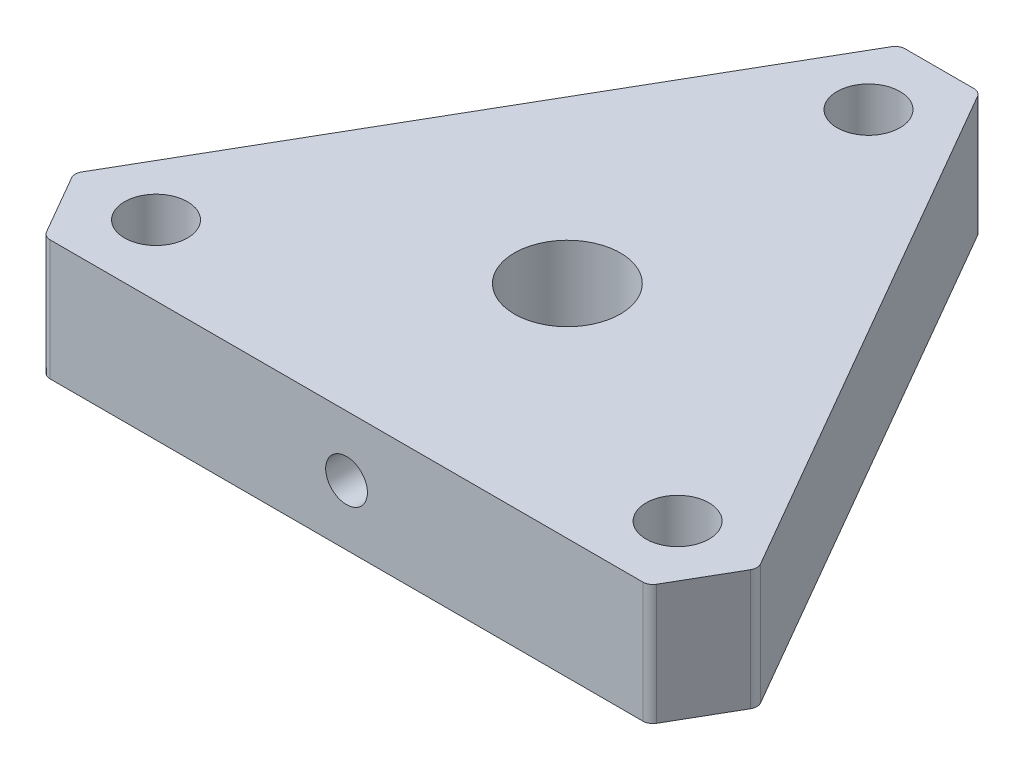
ISO-10303-21;
HEADER;
FILE_DESCRIPTION(('STEP AP214'),'2;1');
FILE_NAME('part.step','',(''),(''),'','','');
FILE_SCHEMA(('AUTOMOTIVE_DESIGN { 1 0 10303 214 1 1 1 1 }'));
ENDSEC;
DATA;
#1=APPLICATION_CONTEXT('core data for automotive mechanical design processes');
#2=APPLICATION_PROTOCOL_DEFINITION('international standard','automotive_design',2000,#1);
#3=PRODUCT_CONTEXT('',#1,'mechanical');
#4=PRODUCT('Part','Part','',(#3));
#5=PRODUCT_RELATED_PRODUCT_CATEGORY('part','',(#4));
#6=PRODUCT_DEFINITION_FORMATION('','',#4);
#7=PRODUCT_DEFINITION_CONTEXT('part definition',#1,'design');
#8=PRODUCT_DEFINITION('design','',#6,#7);
#9=PRODUCT_DEFINITION_SHAPE('','',#8);
#10=(LENGTH_UNIT() NAMED_UNIT(*) SI_UNIT(.MILLI.,.METRE.));
#11=(NAMED_UNIT(*) PLANE_ANGLE_UNIT() SI_UNIT($,.RADIAN.));
#12=(NAMED_UNIT(*) SI_UNIT($,.STERADIAN.) SOLID_ANGLE_UNIT());
#13=UNCERTAINTY_MEASURE_WITH_UNIT(LENGTH_MEASURE(1.E-05),#10,'distance_accuracy_value','');
#14=(GEOMETRIC_REPRESENTATION_CONTEXT(3) GLOBAL_UNCERTAINTY_ASSIGNED_CONTEXT((#13)) GLOBAL_UNIT_ASSIGNED_CONTEXT((#10,
#11,#12)) REPRESENTATION_CONTEXT('',''));
#15=CARTESIAN_POINT('',(0.,0.,0.));
#16=DIRECTION('',(0.,0.,1.));
#17=DIRECTION('',(1.,0.,0.));
#18=AXIS2_PLACEMENT_3D('',#15,#16,#17);
#19=CARTESIAN_POINT('',(-15.1229686135858,-9.525,-8.73125));
#20=DIRECTION('',(0.866025403784439,0.,0.5));
#21=DIRECTION('',(0.5,0.,-0.866025403784439));
#22=AXIS2_PLACEMENT_3D('',#19,#20,#21);
#23=PLANE('',#22);
#24=DIRECTION('',(0.5,0.,-0.866025403784439));
#25=VECTOR('',#24,1.);
#26=CARTESIAN_POINT('',(-15.1229686135858,0.,-8.73125));
#27=LINE('',#26,#25);
#28=CARTESIAN_POINT('',(-26.8418013390869,0.,11.5663636859688));
#29=VERTEX_POINT('',#28);
#30=CARTESIAN_POINT('',(-3.40413588808464,0.,-29.0288636859688));
#31=VERTEX_POINT('',#30);
#32=EDGE_CURVE('E266',#29,#31,#27,.T.);
#33=ORIENTED_EDGE('',*,*,#32,.T.);
#34=DIRECTION('',(0.,1.,0.));
#35=VECTOR('',#34,1.);
#36=CARTESIAN_POINT('',(-3.40413588808464,-9.525,-29.0288636859688));
#37=LINE('',#36,#35);
#38=CARTESIAN_POINT('',(-3.40413588808464,-9.525,-29.0288636859688));
#39=VERTEX_POINT('',#38);
#40=EDGE_CURVE('E156',#31,#39,#37,.F.);
#41=ORIENTED_EDGE('',*,*,#40,.T.);
#42=DIRECTION('',(0.5,0.,-0.866025403784439));
#43=VECTOR('',#42,1.);
#44=CARTESIAN_POINT('',(-15.1229686135858,-9.525,-8.73125));
#45=LINE('',#44,#43);
#46=CARTESIAN_POINT('',(-26.8418013390869,-9.525,11.5663636859688));
#47=VERTEX_POINT('',#46);
#48=EDGE_CURVE('E139',#47,#39,#45,.T.);
#49=ORIENTED_EDGE('',*,*,#48,.F.);
#50=DIRECTION('',(0.,-1.,0.));
#51=VECTOR('',#50,1.);
#52=CARTESIAN_POINT('',(-26.8418013390869,0.,11.5663636859688));
#53=LINE('',#52,#51);
#54=EDGE_CURVE('E153',#47,#29,#53,.F.);
#55=ORIENTED_EDGE('',*,*,#54,.T.);
#56=EDGE_LOOP('',(#33,#41,#49,#55));
#57=FACE_BOUND('',#56,.T.);
#58=ADVANCED_FACE('F42',(#57),#23,.F.);
#59=CARTESIAN_POINT('',(15.1229686135858,-9.525,-8.73124999999999));
#60=DIRECTION('',(-0.866025403784439,0.,0.5));
#61=DIRECTION('',(0.5,0.,0.866025403784439));
#62=AXIS2_PLACEMENT_3D('',#59,#60,#61);
#63=PLANE('',#62);
#64=DIRECTION('',(0.5,0.,0.866025403784439));
#65=VECTOR('',#64,1.);
#66=CARTESIAN_POINT('',(15.1229686135858,-9.525,-8.73124999999999));
#67=LINE('',#66,#65);
#68=CARTESIAN_POINT('',(3.40413588808463,-9.525,-29.0288636859688));
#69=VERTEX_POINT('',#68);
#70=CARTESIAN_POINT('',(26.8418013390869,-9.525,11.5663636859688));
#71=VERTEX_POINT('',#70);
#72=EDGE_CURVE('E254',#69,#71,#67,.T.);
#73=ORIENTED_EDGE('',*,*,#72,.F.);
#74=DIRECTION('',(0.,-1.,0.));
#75=VECTOR('',#74,1.);
#76=CARTESIAN_POINT('',(3.40413588808464,0.,-29.0288636859688));
#77=LINE('',#76,#75);
#78=CARTESIAN_POINT('',(3.40413588808463,0.,-29.0288636859688));
#79=VERTEX_POINT('',#78);
#80=EDGE_CURVE('E210',#69,#79,#77,.F.);
#81=ORIENTED_EDGE('',*,*,#80,.T.);
#82=DIRECTION('',(0.5,0.,0.866025403784439));
#83=VECTOR('',#82,1.);
#84=CARTESIAN_POINT('',(15.1229686135858,0.,-8.73124999999999));
#85=LINE('',#84,#83);
#86=CARTESIAN_POINT('',(26.8418013390869,0.,11.5663636859688));
#87=VERTEX_POINT('',#86);
#88=EDGE_CURVE('E272',#79,#87,#85,.T.);
#89=ORIENTED_EDGE('',*,*,#88,.T.);
#90=DIRECTION('',(0.,1.,0.));
#91=VECTOR('',#90,1.);
#92=CARTESIAN_POINT('',(26.8418013390869,-9.525,11.5663636859688));
#93=LINE('',#92,#91);
#94=EDGE_CURVE('E206',#87,#71,#93,.F.);
#95=ORIENTED_EDGE('',*,*,#94,.T.);
#96=EDGE_LOOP('',(#73,#81,#89,#95));
#97=FACE_BOUND('',#96,.T.);
#98=ADVANCED_FACE('F298',(#97),#63,.F.);
#99=CARTESIAN_POINT('',(0.,-9.525,17.4625));
#100=DIRECTION('',(0.,0.,-1.));
#101=DIRECTION('',(-1.,0.,0.));
#102=AXIS2_PLACEMENT_3D('',#99,#100,#101);
#103=PLANE('',#102);
#104=CARTESIAN_POINT('',(0.,-4.7625,17.4625));
#105=DIRECTION('',(0.,0.,1.));
#106=DIRECTION('',(1.,0.,0.));
#107=AXIS2_PLACEMENT_3D('',#104,#105,#106);
#108=CIRCLE('',#107,1.65);
#109=CARTESIAN_POINT('',(1.65,-4.7625,17.4625));
#110=VERTEX_POINT('',#109);
#111=EDGE_CURVE('E497',#110,#110,#108,.T.);
#112=ORIENTED_EDGE('',*,*,#111,.F.);
#113=EDGE_LOOP('',(#112));
#114=FACE_BOUND('',#113,.T.);
#115=DIRECTION('',(-1.,0.,0.));
#116=VECTOR('',#115,1.);
#117=CARTESIAN_POINT('',(0.,-9.525,17.4625));
#118=LINE('',#117,#116);
#119=CARTESIAN_POINT('',(23.4376654510023,-9.525,17.4625));
#120=VERTEX_POINT('',#119);
#121=CARTESIAN_POINT('',(-23.4376654510022,-9.525,17.4625));
#122=VERTEX_POINT('',#121);
#123=EDGE_CURVE('E158',#120,#122,#118,.T.);
#124=ORIENTED_EDGE('',*,*,#123,.F.);
#125=DIRECTION('',(0.,-1.,0.));
#126=VECTOR('',#125,1.);
#127=CARTESIAN_POINT('',(23.4376654510023,0.,17.4625));
#128=LINE('',#127,#126);
#129=CARTESIAN_POINT('',(23.4376654510023,0.,17.4625));
#130=VERTEX_POINT('',#129);
#131=EDGE_CURVE('E223',#120,#130,#128,.F.);
#132=ORIENTED_EDGE('',*,*,#131,.T.);
#133=DIRECTION('',(-1.,0.,0.));
#134=VECTOR('',#133,1.);
#135=CARTESIAN_POINT('',(0.,0.,17.4625));
#136=LINE('',#135,#134);
#137=CARTESIAN_POINT('',(-23.4376654510022,0.,17.4625));
#138=VERTEX_POINT('',#137);
#139=EDGE_CURVE('E250',#130,#138,#136,.T.);
#140=ORIENTED_EDGE('',*,*,#139,.T.);
#141=DIRECTION('',(0.,1.,0.));
#142=VECTOR('',#141,1.);
#143=CARTESIAN_POINT('',(-23.4376654510022,-9.525,17.4625));
#144=LINE('',#143,#142);
#145=EDGE_CURVE('E219',#138,#122,#144,.F.);
#146=ORIENTED_EDGE('',*,*,#145,.T.);
#147=EDGE_LOOP('',(#124,#132,#140,#146));
#148=FACE_BOUND('',#147,.T.);
#149=ADVANCED_FACE('F248',(#114,#148),#103,.F.);
#150=CARTESIAN_POINT('',(0.,-9.525,0.));
#151=DIRECTION('',(0.,1.,0.));
#152=DIRECTION('',(0.,0.,1.));
#153=AXIS2_PLACEMENT_3D('',#150,#151,#152);
#154=CYLINDRICAL_SURFACE('',#153,4.191);
#155=CARTESIAN_POINT('',(0.,-6.4125,4.191));
#156=CARTESIAN_POINT('',(0.0888158457556823,-6.41249094113766,4.19099341766536));
#157=CARTESIAN_POINT('',(0.177764880560256,-6.40528805716734,4.18814418876151));
#158=CARTESIAN_POINT('',(0.353155927121723,-6.37672334243657,4.17702450689011));
#159=CARTESIAN_POINT('',(0.439590946926124,-6.3553253547076,4.16874021062102));
#160=CARTESIAN_POINT('',(0.607144510389277,-6.29926646932103,4.14764536034035));
#161=CARTESIAN_POINT('',(0.688278901192032,-6.26464744395929,4.13484910585151));
#162=CARTESIAN_POINT('',(0.84352177325669,-6.18329400089782,4.10599494607128));
#163=CARTESIAN_POINT('',(0.917632390428181,-6.13656328257819,4.0899380370337));
#164=CARTESIAN_POINT('',(1.06022307876038,-6.03004625960187,4.05536864600279));
#165=CARTESIAN_POINT('',(1.12833822400152,-5.96979581928466,4.03678156879842));
#166=CARTESIAN_POINT('',(1.25380335570613,-5.83892953605274,3.99959357812475));
#167=CARTESIAN_POINT('',(1.31114838088202,-5.76830894265662,3.98099266222228));
#168=CARTESIAN_POINT('',(1.41586162961505,-5.61503202877802,3.94499915765003));
#169=CARTESIAN_POINT('',(1.46269756189567,-5.53198984934529,3.92769240392701));
#170=CARTESIAN_POINT('',(1.5415745312681,-5.35842188320632,3.89741291058879));
#171=CARTESIAN_POINT('',(1.57362232595398,-5.26789953698217,3.88443819215555));
#172=CARTESIAN_POINT('',(1.62054825265614,-5.08613156046246,3.8650907605999));
#173=CARTESIAN_POINT('',(1.6361237024715,-4.99509537396215,3.85845119541121));
#174=CARTESIAN_POINT('',(1.65184168556898,-4.81147808951401,3.85175033242646));
#175=CARTESIAN_POINT('',(1.65199149406593,-4.71889774044798,3.85168593357646));
#176=CARTESIAN_POINT('',(1.63738364189338,-4.54143610711338,3.85791438799053));
#177=CARTESIAN_POINT('',(1.62362476834576,-4.4564547872734,3.86378131334764));
#178=CARTESIAN_POINT('',(1.58325181281516,-4.29012206675582,3.88049829235843));
#179=CARTESIAN_POINT('',(1.55663556379601,-4.20877128050942,3.89134918601595));
#180=CARTESIAN_POINT('',(1.49080257849365,-4.05008346160615,3.91704661250588));
#181=CARTESIAN_POINT('',(1.45134387869914,-3.97285962277947,3.93196890308473));
#182=CARTESIAN_POINT('',(1.36111561085157,-3.82585198188336,3.96410579365323));
#183=CARTESIAN_POINT('',(1.31034187970958,-3.75607093221447,3.98132123641186));
#184=CARTESIAN_POINT('',(1.19446598451548,-3.62044624594262,4.01767117536539));
#185=CARTESIAN_POINT('',(1.12857695098702,-3.55528581523616,4.03685297491826));
#186=CARTESIAN_POINT('',(0.986597832915397,-3.43672471895447,4.07387816547818));
#187=CARTESIAN_POINT('',(0.910505845613687,-3.38332625179967,4.0917213058671));
#188=CARTESIAN_POINT('',(0.748393400916165,-3.28894591786138,4.12448093323899));
#189=CARTESIAN_POINT('',(0.662214603429931,-3.24821346410338,4.13933681381772));
#190=CARTESIAN_POINT('',(0.483495379818833,-3.18205736439811,4.16399219657345));
#191=CARTESIAN_POINT('',(0.390958105690556,-3.15662619350062,4.17379418384242));
#192=CARTESIAN_POINT('',(0.207881495993995,-3.12315864989849,4.18678859386898));
#193=CARTESIAN_POINT('',(0.117534725496213,-3.11420366048819,4.19032960503432));
#194=CARTESIAN_POINT('',(-0.0634307943026632,-3.11123988946153,4.19149577898519));
#195=CARTESIAN_POINT('',(-0.154049470178872,-3.11722738205413,4.18912241647376));
#196=CARTESIAN_POINT('',(-0.328872867897259,-3.14329705366543,4.1789552553235));
#197=CARTESIAN_POINT('',(-0.41318551210061,-3.16275871219459,4.17140022432156));
#198=CARTESIAN_POINT('',(-0.577275663347891,-3.21438699308657,4.15187501214887));
#199=CARTESIAN_POINT('',(-0.657052583728261,-3.24655525470079,4.13990426132884));
#200=CARTESIAN_POINT('',(-0.812526850993748,-3.32372933839651,4.11226309894459));
#201=CARTESIAN_POINT('',(-0.888027021033902,-3.36909500002039,4.09649147004093));
#202=CARTESIAN_POINT('',(-1.03060573078238,-3.47097513711603,4.06296760337092));
#203=CARTESIAN_POINT('',(-1.09768093922277,-3.52749400004559,4.04521458736227));
#204=CARTESIAN_POINT('',(-1.22600457951162,-3.65432085216207,4.00825839478138));
#205=CARTESIAN_POINT('',(-1.28660562031798,-3.72527972465676,3.98903510930352));
#206=CARTESIAN_POINT('',(-1.39519096125041,-3.87671037023537,3.95236848825752));
#207=CARTESIAN_POINT('',(-1.4431734493971,-3.95718350713151,3.93492540854043));
#208=CARTESIAN_POINT('',(-1.52539196258602,-4.12642137481455,3.90379538539524));
#209=CARTESIAN_POINT('',(-1.55951277411068,-4.21524833337029,3.89014021106805));
#210=CARTESIAN_POINT('',(-1.61205819353648,-4.39808417423872,3.86866521081948));
#211=CARTESIAN_POINT('',(-1.63049388759021,-4.49208934649887,3.86084126390524));
#212=CARTESIAN_POINT('',(-1.65010301393227,-4.67551984736178,3.85249841101615));
#213=CARTESIAN_POINT('',(-1.65239488341618,-4.76480489775199,3.85150631450324));
#214=CARTESIAN_POINT('',(-1.64256998966359,-4.94242157066933,3.85570657247587));
#215=CARTESIAN_POINT('',(-1.6304549232458,-5.03075330423979,3.86089819865564));
#216=CARTESIAN_POINT('',(-1.59306300379967,-5.20060526530856,3.87646941588227));
#217=CARTESIAN_POINT('',(-1.56829119555613,-5.28225662022843,3.88664936098943));
#218=CARTESIAN_POINT('',(-1.50675425482096,-5.44028063619145,3.91091561007294));
#219=CARTESIAN_POINT('',(-1.4699859561527,-5.51665189722879,3.92500294516085));
#220=CARTESIAN_POINT('',(-1.38311529843662,-5.666610946537,3.95647806209636));
#221=CARTESIAN_POINT('',(-1.33238092518634,-5.73980260641793,3.97400660548189));
#222=CARTESIAN_POINT('',(-1.21995258929766,-5.87698936075253,4.0099471536531));
#223=CARTESIAN_POINT('',(-1.15825479945548,-5.94098122950583,4.02835946530861));
#224=CARTESIAN_POINT('',(-1.02109021882295,-6.06201904081777,4.06536630080161));
#225=CARTESIAN_POINT('',(-0.945006241951451,-6.11838670855431,4.08390111284132));
#226=CARTESIAN_POINT('',(-0.783771653011255,-6.21754320654018,4.11788228990927));
#227=CARTESIAN_POINT('',(-0.698619836058073,-6.26033022925429,4.13332824372041));
#228=CARTESIAN_POINT('',(-0.529129248708291,-6.32778847068085,4.15827063449535));
#229=CARTESIAN_POINT('',(-0.445336693957744,-6.35369047800564,4.16816120836269));
#230=CARTESIAN_POINT('',(-0.274422274674914,-6.39186028484687,4.18287892311425));
#231=CARTESIAN_POINT('',(-0.187310248651953,-6.40416555772527,4.18771997867806));
#232=CARTESIAN_POINT('',(-0.066598092212308,-6.4114950129305,4.19060513064526));
#233=CARTESIAN_POINT('',(-0.0333084123503266,-6.41250339732532,4.19100246855856));
#234=CARTESIAN_POINT('',(0.,-6.4125,4.191));
#235=B_SPLINE_CURVE_WITH_KNOTS('',3,(#155,#156,#157,#158,#159,#160,#161,#162,#163,#164,#165,
#166,#167,#168,#169,#170,#171,#172,#173,#174,#175,#176,#177,#178,#179,#180,#181,#182,#183,#184,
#185,#186,#187,#188,#189,#190,#191,#192,#193,#194,#195,#196,#197,#198,#199,#200,#201,#202,#203,
#204,#205,#206,#207,#208,#209,#210,#211,#212,#213,#214,#215,#216,#217,#218,#219,#220,#221,#222,
#223,#224,#225,#226,#227,#228,#229,#230,#231,#232,#233,#234),.UNSPECIFIED.,.T.,.F.,(4,2,2,2,2,2,
2,2,2,2,2,2,2,2,2,2,2,2,2,2,2,2,2,2,2,2,2,2,2,2,2,2,2,2,2,2,2,2,2,4),(0.,0.266348857822805,
0.53337876280673,0.799569879307011,1.06567978635152,1.34291488895841,1.62027738916733,
1.909515424916,2.19862115911344,2.47492767503142,2.7511038755584,3.00876404222583,
3.26646765118223,3.52933874349863,3.79230671295029,4.07491283422818,4.35757173248197,
4.64548790029414,4.93326235910823,5.20444010040905,5.47555023241662,5.73493994739244,
5.99436313660958,6.26165625650323,6.52905473480423,6.81356184108431,7.09810977929479,
7.38497664074594,7.67164057747958,7.93822995909572,8.20478794548296,8.46145535657154,
8.71819056353901,8.98932000115446,9.26054427357451,9.54861437622264,9.83672280390812,
10.1003398491481,10.3632285246719,10.4631167541867),.UNSPECIFIED.);
#236=CARTESIAN_POINT('',(0.,-6.4125,4.191));
#237=VERTEX_POINT('',#236);
#238=EDGE_CURVE('E500',#237,#237,#235,.T.);
#239=ORIENTED_EDGE('',*,*,#238,.T.);
#240=EDGE_LOOP('',(#239));
#241=FACE_BOUND('',#240,.T.);
#242=CARTESIAN_POINT('',(0.,-9.525,0.));
#243=DIRECTION('',(0.,1.,0.));
#244=DIRECTION('',(0.,0.,1.));
#245=AXIS2_PLACEMENT_3D('',#242,#243,#244);
#246=CIRCLE('',#245,4.191);
#247=CARTESIAN_POINT('',(0.,-9.525,4.191));
#248=VERTEX_POINT('',#247);
#249=EDGE_CURVE('E258',#248,#248,#246,.T.);
#250=ORIENTED_EDGE('',*,*,#249,.F.);
#251=EDGE_LOOP('',(#250));
#252=FACE_BOUND('',#251,.T.);
#253=CARTESIAN_POINT('',(0.,0.,0.));
#254=DIRECTION('',(0.,1.,0.));
#255=DIRECTION('',(0.,0.,1.));
#256=AXIS2_PLACEMENT_3D('',#253,#254,#255);
#257=CIRCLE('',#256,4.191);
#258=CARTESIAN_POINT('',(0.,0.,4.191));
#259=VERTEX_POINT('',#258);
#260=EDGE_CURVE('E159',#259,#259,#257,.T.);
#261=ORIENTED_EDGE('',*,*,#260,.T.);
#262=EDGE_LOOP('',(#261));
#263=FACE_BOUND('',#262,.T.);
#264=ADVANCED_FACE('F454',(#241,#252,#263),#154,.F.);
#265=CARTESIAN_POINT('',(0.,-9.525,0.));
#266=DIRECTION('',(0.,1.,0.));
#267=DIRECTION('',(0.,0.,1.));
#268=AXIS2_PLACEMENT_3D('',#265,#266,#267);
#269=PLANE('',#268);
#270=CARTESIAN_POINT('',(0.,-9.525,-23.8125));
#271=DIRECTION('',(0.,1.,0.));
#272=DIRECTION('',(0.,0.,1.));
#273=AXIS2_PLACEMENT_3D('',#270,#271,#272);
#274=CIRCLE('',#273,2.4892);
#275=CARTESIAN_POINT('',(0.,-9.525,-21.3233));
#276=VERTEX_POINT('',#275);
#277=EDGE_CURVE('E516',#276,#276,#274,.T.);
#278=ORIENTED_EDGE('',*,*,#277,.T.);
#279=EDGE_LOOP('',(#278));
#280=FACE_BOUND('',#279,.T.);
#281=CARTESIAN_POINT('',(20.6222299276169,-9.525,11.90625));
#282=DIRECTION('',(0.,1.,0.));
#283=DIRECTION('',(0.,0.,1.));
#284=AXIS2_PLACEMENT_3D('',#281,#282,#283);
#285=CIRCLE('',#284,2.4892);
#286=CARTESIAN_POINT('',(20.6222299276169,-9.525,14.39545));
#287=VERTEX_POINT('',#286);
#288=EDGE_CURVE('E524',#287,#287,#285,.T.);
#289=ORIENTED_EDGE('',*,*,#288,.T.);
#290=EDGE_LOOP('',(#289));
#291=FACE_BOUND('',#290,.T.);
#292=CARTESIAN_POINT('',(-20.6222299276169,-9.525,11.90625));
#293=DIRECTION('',(0.,1.,0.));
#294=DIRECTION('',(0.,0.,1.));
#295=AXIS2_PLACEMENT_3D('',#292,#293,#294);
#296=CIRCLE('',#295,2.4892);
#297=CARTESIAN_POINT('',(-20.6222299276169,-9.525,14.39545));
#298=VERTEX_POINT('',#297);
#299=EDGE_CURVE('E269',#298,#298,#296,.T.);
#300=ORIENTED_EDGE('',*,*,#299,.T.);
#301=EDGE_LOOP('',(#300));
#302=FACE_BOUND('',#301,.T.);
#303=ORIENTED_EDGE('',*,*,#48,.T.);
#304=CARTESIAN_POINT('',(-2.71672822383075,-9.525,-28.6319886859688));
#305=DIRECTION('',(0.,1.,0.));
#306=DIRECTION('',(0.,0.,1.));
#307=AXIS2_PLACEMENT_3D('',#304,#305,#306);
#308=CIRCLE('',#307,0.79375);
#309=CARTESIAN_POINT('',(-2.71672822383075,-9.525,-29.4257386859688));
#310=VERTEX_POINT('',#309);
#311=EDGE_CURVE('E182',#39,#310,#308,.F.);
#312=ORIENTED_EDGE('',*,*,#311,.T.);
#313=DIRECTION('',(-1.,0.,0.));
#314=VECTOR('',#313,1.);
#315=CARTESIAN_POINT('',(3.175,-9.525,-29.4257386859688));
#316=LINE('',#315,#314);
#317=CARTESIAN_POINT('',(2.71672822383074,-9.525,-29.4257386859688));
#318=VERTEX_POINT('',#317);
#319=EDGE_CURVE('E241',#310,#318,#316,.F.);
#320=ORIENTED_EDGE('',*,*,#319,.T.);
#321=CARTESIAN_POINT('',(2.71672822383074,-9.525,-28.6319886859688));
#322=DIRECTION('',(0.,1.,0.));
#323=DIRECTION('',(0.,0.,1.));
#324=AXIS2_PLACEMENT_3D('',#321,#322,#323);
#325=CIRCLE('',#324,0.79375);
#326=EDGE_CURVE('E179',#318,#69,#325,.F.);
#327=ORIENTED_EDGE('',*,*,#326,.T.);
#328=ORIENTED_EDGE('',*,*,#72,.T.);
#329=CARTESIAN_POINT('',(26.154393674833,-9.525,11.9632386859688));
#330=DIRECTION('',(0.,1.,0.));
#331=DIRECTION('',(0.,0.,1.));
#332=AXIS2_PLACEMENT_3D('',#329,#330,#331);
#333=CIRCLE('',#332,0.79375);
#334=CARTESIAN_POINT('',(26.8418013390869,-9.525,12.3601136859688));
#335=VERTEX_POINT('',#334);
#336=EDGE_CURVE('E176',#71,#335,#333,.F.);
#337=ORIENTED_EDGE('',*,*,#336,.T.);
#338=DIRECTION('',(0.499999999999998,0.,-0.86602540378444));
#339=VECTOR('',#338,1.);
#340=CARTESIAN_POINT('',(23.8959372271715,-9.525,17.4625));
#341=LINE('',#340,#339);
#342=CARTESIAN_POINT('',(24.1250731152562,-9.525,17.065625));
#343=VERTEX_POINT('',#342);
#344=EDGE_CURVE('E168',#335,#343,#341,.F.);
#345=ORIENTED_EDGE('',*,*,#344,.T.);
#346=CARTESIAN_POINT('',(23.4376654510023,-9.525,16.66875));
#347=DIRECTION('',(0.,1.,0.));
#348=DIRECTION('',(0.,0.,1.));
#349=AXIS2_PLACEMENT_3D('',#346,#347,#348);
#350=CIRCLE('',#349,0.79375);
#351=EDGE_CURVE('E146',#343,#120,#350,.F.);
#352=ORIENTED_EDGE('',*,*,#351,.T.);
#353=ORIENTED_EDGE('',*,*,#123,.T.);
#354=CARTESIAN_POINT('',(-23.4376654510022,-9.525,16.66875));
#355=DIRECTION('',(0.,1.,0.));
#356=DIRECTION('',(0.,0.,1.));
#357=AXIS2_PLACEMENT_3D('',#354,#355,#356);
#358=CIRCLE('',#357,0.79375);
#359=CARTESIAN_POINT('',(-24.1250731152561,-9.525,17.065625));
#360=VERTEX_POINT('',#359);
#361=EDGE_CURVE('E147',#122,#360,#358,.F.);
#362=ORIENTED_EDGE('',*,*,#361,.T.);
#363=DIRECTION('',(0.500000000000001,0.,0.866025403784438));
#364=VECTOR('',#363,1.);
#365=CARTESIAN_POINT('',(-27.0709372271715,-9.525,11.9632386859688));
#366=LINE('',#365,#364);
#367=CARTESIAN_POINT('',(-26.8418013390869,-9.525,12.3601136859688));
#368=VERTEX_POINT('',#367);
#369=EDGE_CURVE('E141',#360,#368,#366,.F.);
#370=ORIENTED_EDGE('',*,*,#369,.T.);
#371=CARTESIAN_POINT('',(-26.154393674833,-9.525,11.9632386859688));
#372=DIRECTION('',(0.,1.,0.));
#373=DIRECTION('',(0.,0.,1.));
#374=AXIS2_PLACEMENT_3D('',#371,#372,#373);
#375=CIRCLE('',#374,0.79375);
#376=EDGE_CURVE('E135',#368,#47,#375,.F.);
#377=ORIENTED_EDGE('',*,*,#376,.T.);
#378=EDGE_LOOP('',(#303,#312,#320,#327,#328,#337,#345,#352,#353,#362,#370,#377));
#379=FACE_BOUND('',#378,.T.);
#380=ORIENTED_EDGE('',*,*,#249,.T.);
#381=EDGE_LOOP('',(#380));
#382=FACE_BOUND('',#381,.T.);
#383=ADVANCED_FACE('F137',(#280,#291,#302,#379,#382),#269,.F.);
#384=CARTESIAN_POINT('',(0.,0.,0.));
#385=DIRECTION('',(0.,1.,0.));
#386=DIRECTION('',(0.,0.,1.));
#387=AXIS2_PLACEMENT_3D('',#384,#385,#386);
#388=PLANE('',#387);
#389=CARTESIAN_POINT('',(0.,0.,-23.8125));
#390=DIRECTION('',(0.,1.,0.));
#391=DIRECTION('',(0.,0.,1.));
#392=AXIS2_PLACEMENT_3D('',#389,#390,#391);
#393=CIRCLE('',#392,2.4892);
#394=CARTESIAN_POINT('',(0.,0.,-21.3233));
#395=VERTEX_POINT('',#394);
#396=EDGE_CURVE('E504',#395,#395,#393,.T.);
#397=ORIENTED_EDGE('',*,*,#396,.F.);
#398=EDGE_LOOP('',(#397));
#399=FACE_BOUND('',#398,.T.);
#400=CARTESIAN_POINT('',(20.6222299276169,0.,11.90625));
#401=DIRECTION('',(0.,1.,0.));
#402=DIRECTION('',(0.,0.,1.));
#403=AXIS2_PLACEMENT_3D('',#400,#401,#402);
#404=CIRCLE('',#403,2.4892);
#405=CARTESIAN_POINT('',(20.6222299276169,0.,14.39545));
#406=VERTEX_POINT('',#405);
#407=EDGE_CURVE('E520',#406,#406,#404,.T.);
#408=ORIENTED_EDGE('',*,*,#407,.F.);
#409=EDGE_LOOP('',(#408));
#410=FACE_BOUND('',#409,.T.);
#411=CARTESIAN_POINT('',(-20.6222299276169,0.,11.90625));
#412=DIRECTION('',(0.,1.,0.));
#413=DIRECTION('',(0.,0.,1.));
#414=AXIS2_PLACEMENT_3D('',#411,#412,#413);
#415=CIRCLE('',#414,2.4892);
#416=CARTESIAN_POINT('',(-20.6222299276169,0.,14.39545));
#417=VERTEX_POINT('',#416);
#418=EDGE_CURVE('E528',#417,#417,#415,.T.);
#419=ORIENTED_EDGE('',*,*,#418,.F.);
#420=EDGE_LOOP('',(#419));
#421=FACE_BOUND('',#420,.T.);
#422=DIRECTION('',(1.,0.,0.));
#423=VECTOR('',#422,1.);
#424=CARTESIAN_POINT('',(0.,0.,-29.4257386859688));
#425=LINE('',#424,#423);
#426=CARTESIAN_POINT('',(2.71672822383074,0.,-29.4257386859688));
#427=VERTEX_POINT('',#426);
#428=CARTESIAN_POINT('',(-2.71672822383075,0.,-29.4257386859688));
#429=VERTEX_POINT('',#428);
#430=EDGE_CURVE('E265',#427,#429,#425,.F.);
#431=ORIENTED_EDGE('',*,*,#430,.T.);
#432=CARTESIAN_POINT('',(-2.71672822383075,0.,-28.6319886859688));
#433=DIRECTION('',(0.,1.,0.));
#434=DIRECTION('',(0.,0.,1.));
#435=AXIS2_PLACEMENT_3D('',#432,#433,#434);
#436=CIRCLE('',#435,0.79375);
#437=EDGE_CURVE('E203',#429,#31,#436,.T.);
#438=ORIENTED_EDGE('',*,*,#437,.T.);
#439=ORIENTED_EDGE('',*,*,#32,.F.);
#440=CARTESIAN_POINT('',(-26.154393674833,0.,11.9632386859688));
#441=DIRECTION('',(0.,1.,0.));
#442=DIRECTION('',(0.,0.,1.));
#443=AXIS2_PLACEMENT_3D('',#440,#441,#442);
#444=CIRCLE('',#443,0.79375);
#445=CARTESIAN_POINT('',(-26.8418013390869,0.,12.3601136859688));
#446=VERTEX_POINT('',#445);
#447=EDGE_CURVE('E162',#29,#446,#444,.T.);
#448=ORIENTED_EDGE('',*,*,#447,.T.);
#449=DIRECTION('',(-0.500000000000001,0.,-0.866025403784438));
#450=VECTOR('',#449,1.);
#451=CARTESIAN_POINT('',(-25.4834372271715,0.,14.7128693429844));
#452=LINE('',#451,#450);
#453=CARTESIAN_POINT('',(-24.1250731152561,0.,17.065625));
#454=VERTEX_POINT('',#453);
#455=EDGE_CURVE('E232',#446,#454,#452,.F.);
#456=ORIENTED_EDGE('',*,*,#455,.T.);
#457=CARTESIAN_POINT('',(-23.4376654510022,0.,16.66875));
#458=DIRECTION('',(0.,1.,0.));
#459=DIRECTION('',(0.,0.,1.));
#460=AXIS2_PLACEMENT_3D('',#457,#458,#459);
#461=CIRCLE('',#460,0.79375);
#462=EDGE_CURVE('E191',#454,#138,#461,.T.);
#463=ORIENTED_EDGE('',*,*,#462,.T.);
#464=ORIENTED_EDGE('',*,*,#139,.F.);
#465=CARTESIAN_POINT('',(23.4376654510023,0.,16.66875));
#466=DIRECTION('',(0.,1.,0.));
#467=DIRECTION('',(0.,0.,1.));
#468=AXIS2_PLACEMENT_3D('',#465,#466,#467);
#469=CIRCLE('',#468,0.79375);
#470=CARTESIAN_POINT('',(24.1250731152562,0.,17.065625));
#471=VERTEX_POINT('',#470);
#472=EDGE_CURVE('E196',#130,#471,#469,.T.);
#473=ORIENTED_EDGE('',*,*,#472,.T.);
#474=DIRECTION('',(-0.499999999999998,0.,0.86602540378444));
#475=VECTOR('',#474,1.);
#476=CARTESIAN_POINT('',(25.4834372271716,0.,14.7128693429844));
#477=LINE('',#476,#475);
#478=CARTESIAN_POINT('',(26.8418013390869,0.,12.3601136859688));
#479=VERTEX_POINT('',#478);
#480=EDGE_CURVE('E242',#471,#479,#477,.F.);
#481=ORIENTED_EDGE('',*,*,#480,.T.);
#482=CARTESIAN_POINT('',(26.154393674833,0.,11.9632386859688));
#483=DIRECTION('',(0.,1.,0.));
#484=DIRECTION('',(0.,0.,1.));
#485=AXIS2_PLACEMENT_3D('',#482,#483,#484);
#486=CIRCLE('',#485,0.79375);
#487=EDGE_CURVE('E58',#479,#87,#486,.T.);
#488=ORIENTED_EDGE('',*,*,#487,.T.);
#489=ORIENTED_EDGE('',*,*,#88,.F.);
#490=CARTESIAN_POINT('',(2.71672822383074,0.,-28.6319886859688));
#491=DIRECTION('',(0.,1.,0.));
#492=DIRECTION('',(0.,0.,1.));
#493=AXIS2_PLACEMENT_3D('',#490,#491,#492);
#494=CIRCLE('',#493,0.79375);
#495=EDGE_CURVE('E66',#79,#427,#494,.T.);
#496=ORIENTED_EDGE('',*,*,#495,.T.);
#497=EDGE_LOOP('',(#431,#438,#439,#448,#456,#463,#464,#473,#481,#488,#489,#496));
#498=FACE_BOUND('',#497,.T.);
#499=ORIENTED_EDGE('',*,*,#260,.F.);
#500=EDGE_LOOP('',(#499));
#501=FACE_BOUND('',#500,.T.);
#502=ADVANCED_FACE('F236',(#399,#410,#421,#498,#501),#388,.T.);
#503=CARTESIAN_POINT('',(-20.6222299276169,0.,11.90625));
#504=DIRECTION('',(0.,1.,0.));
#505=DIRECTION('',(0.,0.,1.));
#506=AXIS2_PLACEMENT_3D('',#503,#504,#505);
#507=CYLINDRICAL_SURFACE('',#506,2.4892);
#508=ORIENTED_EDGE('',*,*,#299,.F.);
#509=EDGE_LOOP('',(#508));
#510=FACE_BOUND('',#509,.T.);
#511=ORIENTED_EDGE('',*,*,#418,.T.);
#512=EDGE_LOOP('',(#511));
#513=FACE_BOUND('',#512,.T.);
#514=ADVANCED_FACE('F422',(#510,#513),#507,.F.);
#515=CARTESIAN_POINT('',(20.6222299276169,0.,11.90625));
#516=DIRECTION('',(0.,1.,0.));
#517=DIRECTION('',(0.,0.,1.));
#518=AXIS2_PLACEMENT_3D('',#515,#516,#517);
#519=CYLINDRICAL_SURFACE('',#518,2.4892);
#520=ORIENTED_EDGE('',*,*,#288,.F.);
#521=EDGE_LOOP('',(#520));
#522=FACE_BOUND('',#521,.T.);
#523=ORIENTED_EDGE('',*,*,#407,.T.);
#524=EDGE_LOOP('',(#523));
#525=FACE_BOUND('',#524,.T.);
#526=ADVANCED_FACE('F413',(#522,#525),#519,.F.);
#527=CARTESIAN_POINT('',(0.,0.,-23.8125));
#528=DIRECTION('',(0.,1.,0.));
#529=DIRECTION('',(0.,0.,1.));
#530=AXIS2_PLACEMENT_3D('',#527,#528,#529);
#531=CYLINDRICAL_SURFACE('',#530,2.4892);
#532=ORIENTED_EDGE('',*,*,#277,.F.);
#533=EDGE_LOOP('',(#532));
#534=FACE_BOUND('',#533,.T.);
#535=ORIENTED_EDGE('',*,*,#396,.T.);
#536=EDGE_LOOP('',(#535));
#537=FACE_BOUND('',#536,.T.);
#538=ADVANCED_FACE('F403',(#534,#537),#531,.F.);
#539=CARTESIAN_POINT('',(0.,-4.7625,17.4625));
#540=DIRECTION('',(0.,0.,1.));
#541=DIRECTION('',(1.,0.,0.));
#542=AXIS2_PLACEMENT_3D('',#539,#540,#541);
#543=CYLINDRICAL_SURFACE('',#542,1.65);
#544=ORIENTED_EDGE('',*,*,#238,.F.);
#545=EDGE_LOOP('',(#544));
#546=FACE_BOUND('',#545,.T.);
#547=ORIENTED_EDGE('',*,*,#111,.T.);
#548=EDGE_LOOP('',(#547));
#549=FACE_BOUND('',#548,.T.);
#550=ADVANCED_FACE('F333',(#546,#549),#543,.F.);
#551=CARTESIAN_POINT('',(-27.0709372271715,-9.525,11.9632386859688));
#552=DIRECTION('',(0.866025403784438,0.,-0.500000000000001));
#553=DIRECTION('',(0.,1.,0.));
#554=AXIS2_PLACEMENT_3D('',#551,#552,#553);
#555=PLANE('',#554);
#556=ORIENTED_EDGE('',*,*,#455,.F.);
#557=DIRECTION('',(0.,1.,0.));
#558=VECTOR('',#557,1.);
#559=CARTESIAN_POINT('',(-26.8418013390869,-9.525,12.3601136859688));
#560=LINE('',#559,#558);
#561=EDGE_CURVE('E11',#446,#368,#560,.F.);
#562=ORIENTED_EDGE('',*,*,#561,.T.);
#563=ORIENTED_EDGE('',*,*,#369,.F.);
#564=DIRECTION('',(0.,-1.,0.));
#565=VECTOR('',#564,1.);
#566=CARTESIAN_POINT('',(-24.1250731152561,0.,17.065625));
#567=LINE('',#566,#565);
#568=EDGE_CURVE('E51',#360,#454,#567,.F.);
#569=ORIENTED_EDGE('',*,*,#568,.T.);
#570=EDGE_LOOP('',(#556,#562,#563,#569));
#571=FACE_BOUND('',#570,.T.);
#572=ADVANCED_FACE('F231',(#571),#555,.F.);
#573=CARTESIAN_POINT('',(23.8959372271715,-9.525,17.4625));
#574=DIRECTION('',(-0.86602540378444,0.,-0.499999999999998));
#575=DIRECTION('',(0.,1.,0.));
#576=AXIS2_PLACEMENT_3D('',#573,#574,#575);
#577=PLANE('',#576);
#578=ORIENTED_EDGE('',*,*,#344,.F.);
#579=DIRECTION('',(0.,-1.,0.));
#580=VECTOR('',#579,1.);
#581=CARTESIAN_POINT('',(26.8418013390869,0.,12.3601136859688));
#582=LINE('',#581,#580);
#583=EDGE_CURVE('E216',#335,#479,#582,.F.);
#584=ORIENTED_EDGE('',*,*,#583,.T.);
#585=ORIENTED_EDGE('',*,*,#480,.F.);
#586=DIRECTION('',(0.,1.,0.));
#587=VECTOR('',#586,1.);
#588=CARTESIAN_POINT('',(24.1250731152562,-9.525,17.065625));
#589=LINE('',#588,#587);
#590=EDGE_CURVE('E213',#471,#343,#589,.F.);
#591=ORIENTED_EDGE('',*,*,#590,.T.);
#592=EDGE_LOOP('',(#578,#584,#585,#591));
#593=FACE_BOUND('',#592,.T.);
#594=ADVANCED_FACE('F292',(#593),#577,.F.);
#595=CARTESIAN_POINT('',(3.175,-9.525,-29.4257386859688));
#596=DIRECTION('',(0.,0.,1.));
#597=DIRECTION('',(0.,1.,0.));
#598=AXIS2_PLACEMENT_3D('',#595,#596,#597);
#599=PLANE('',#598);
#600=ORIENTED_EDGE('',*,*,#319,.F.);
#601=DIRECTION('',(0.,-1.,0.));
#602=VECTOR('',#601,1.);
#603=CARTESIAN_POINT('',(-2.71672822383075,0.,-29.4257386859688));
#604=LINE('',#603,#602);
#605=EDGE_CURVE('E188',#310,#429,#604,.F.);
#606=ORIENTED_EDGE('',*,*,#605,.T.);
#607=ORIENTED_EDGE('',*,*,#430,.F.);
#608=DIRECTION('',(0.,1.,0.));
#609=VECTOR('',#608,1.);
#610=CARTESIAN_POINT('',(2.71672822383074,-9.525,-29.4257386859688));
#611=LINE('',#610,#609);
#612=EDGE_CURVE('E185',#427,#318,#611,.F.);
#613=ORIENTED_EDGE('',*,*,#612,.T.);
#614=EDGE_LOOP('',(#600,#606,#607,#613));
#615=FACE_BOUND('',#614,.T.);
#616=ADVANCED_FACE('F305',(#615),#599,.F.);
#617=CARTESIAN_POINT('',(-2.71672822383075,-9.525,-28.6319886859688));
#618=DIRECTION('',(0.,-1.,0.));
#619=DIRECTION('',(0.,0.,-1.));
#620=AXIS2_PLACEMENT_3D('',#617,#618,#619);
#621=CYLINDRICAL_SURFACE('',#620,0.79375);
#622=ORIENTED_EDGE('',*,*,#437,.F.);
#623=ORIENTED_EDGE('',*,*,#605,.F.);
#624=ORIENTED_EDGE('',*,*,#311,.F.);
#625=ORIENTED_EDGE('',*,*,#40,.F.);
#626=EDGE_LOOP('',(#622,#623,#624,#625));
#627=FACE_BOUND('',#626,.T.);
#628=ADVANCED_FACE('F308',(#627),#621,.T.);
#629=CARTESIAN_POINT('',(2.71672822383074,-9.525,-28.6319886859688));
#630=DIRECTION('',(0.,1.,0.));
#631=DIRECTION('',(0.,0.,1.));
#632=AXIS2_PLACEMENT_3D('',#629,#630,#631);
#633=CYLINDRICAL_SURFACE('',#632,0.79375);
#634=ORIENTED_EDGE('',*,*,#326,.F.);
#635=ORIENTED_EDGE('',*,*,#612,.F.);
#636=ORIENTED_EDGE('',*,*,#495,.F.);
#637=ORIENTED_EDGE('',*,*,#80,.F.);
#638=EDGE_LOOP('',(#634,#635,#636,#637));
#639=FACE_BOUND('',#638,.T.);
#640=ADVANCED_FACE('F301',(#639),#633,.T.);
#641=CARTESIAN_POINT('',(26.154393674833,-9.525,11.9632386859688));
#642=DIRECTION('',(0.,-1.,0.));
#643=DIRECTION('',(0.,0.,-1.));
#644=AXIS2_PLACEMENT_3D('',#641,#642,#643);
#645=CYLINDRICAL_SURFACE('',#644,0.79375);
#646=ORIENTED_EDGE('',*,*,#487,.F.);
#647=ORIENTED_EDGE('',*,*,#583,.F.);
#648=ORIENTED_EDGE('',*,*,#336,.F.);
#649=ORIENTED_EDGE('',*,*,#94,.F.);
#650=EDGE_LOOP('',(#646,#647,#648,#649));
#651=FACE_BOUND('',#650,.T.);
#652=ADVANCED_FACE('F294',(#651),#645,.T.);
#653=CARTESIAN_POINT('',(23.4376654510023,-9.525,16.66875));
#654=DIRECTION('',(0.,1.,0.));
#655=DIRECTION('',(0.,0.,1.));
#656=AXIS2_PLACEMENT_3D('',#653,#654,#655);
#657=CYLINDRICAL_SURFACE('',#656,0.79375);
#658=ORIENTED_EDGE('',*,*,#351,.F.);
#659=ORIENTED_EDGE('',*,*,#590,.F.);
#660=ORIENTED_EDGE('',*,*,#472,.F.);
#661=ORIENTED_EDGE('',*,*,#131,.F.);
#662=EDGE_LOOP('',(#658,#659,#660,#661));
#663=FACE_BOUND('',#662,.T.);
#664=ADVANCED_FACE('F290',(#663),#657,.T.);
#665=CARTESIAN_POINT('',(-26.154393674833,-9.525,11.9632386859688));
#666=DIRECTION('',(0.,1.,0.));
#667=DIRECTION('',(0.,0.,1.));
#668=AXIS2_PLACEMENT_3D('',#665,#666,#667);
#669=CYLINDRICAL_SURFACE('',#668,0.79375);
#670=ORIENTED_EDGE('',*,*,#376,.F.);
#671=ORIENTED_EDGE('',*,*,#561,.F.);
#672=ORIENTED_EDGE('',*,*,#447,.F.);
#673=ORIENTED_EDGE('',*,*,#54,.F.);
#674=EDGE_LOOP('',(#670,#671,#672,#673));
#675=FACE_BOUND('',#674,.T.);
#676=ADVANCED_FACE('F161',(#675),#669,.T.);
#677=CARTESIAN_POINT('',(-23.4376654510022,-9.525,16.66875));
#678=DIRECTION('',(0.,-1.,0.));
#679=DIRECTION('',(0.,0.,-1.));
#680=AXIS2_PLACEMENT_3D('',#677,#678,#679);
#681=CYLINDRICAL_SURFACE('',#680,0.79375);
#682=ORIENTED_EDGE('',*,*,#462,.F.);
#683=ORIENTED_EDGE('',*,*,#568,.F.);
#684=ORIENTED_EDGE('',*,*,#361,.F.);
#685=ORIENTED_EDGE('',*,*,#145,.F.);
#686=EDGE_LOOP('',(#682,#683,#684,#685));
#687=FACE_BOUND('',#686,.T.);
#688=ADVANCED_FACE('F44',(#687),#681,.T.);
#689=CLOSED_SHELL('',(#58,#98,#149,#264,#383,#502,#514,#526,#538,#550,#572,#594,#616,#628,#640,
#652,#664,#676,#688));
#690=MANIFOLD_SOLID_BREP('B2',#689);
#691=ADVANCED_BREP_SHAPE_REPRESENTATION('',(#18,#690),#14);
#692=SHAPE_DEFINITION_REPRESENTATION(#9,#691);
ENDSEC;
END-ISO-10303-21;
